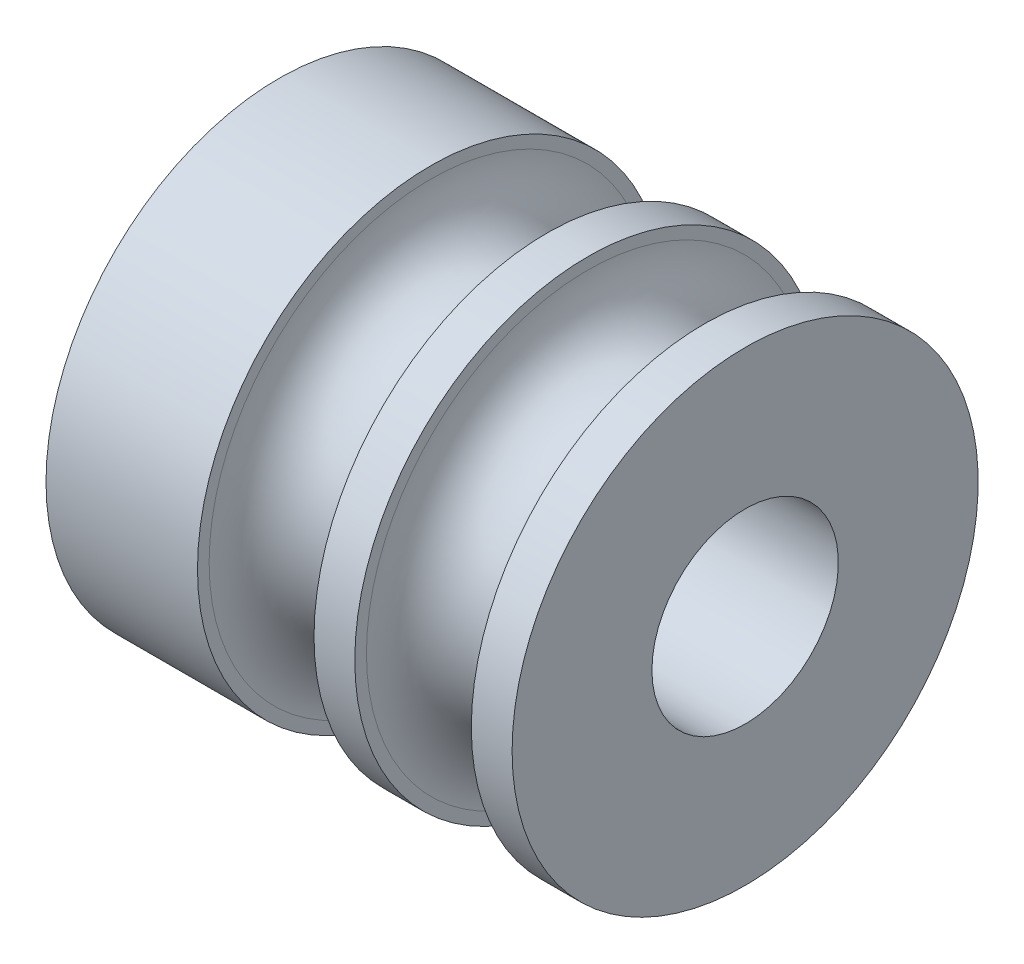
ISO-10303-21;
HEADER;
FILE_DESCRIPTION(('STEP AP214'),'2;1');
FILE_NAME('part.step','',(''),(''),'','','');
FILE_SCHEMA(('AUTOMOTIVE_DESIGN { 1 0 10303 214 1 1 1 1 }'));
ENDSEC;
DATA;
#1=APPLICATION_CONTEXT('core data for automotive mechanical design processes');
#2=APPLICATION_PROTOCOL_DEFINITION('international standard','automotive_design',2000,#1);
#3=PRODUCT_CONTEXT('',#1,'mechanical');
#4=PRODUCT('Part','Part','',(#3));
#5=PRODUCT_RELATED_PRODUCT_CATEGORY('part','',(#4));
#6=PRODUCT_DEFINITION_FORMATION('','',#4);
#7=PRODUCT_DEFINITION_CONTEXT('part definition',#1,'design');
#8=PRODUCT_DEFINITION('design','',#6,#7);
#9=PRODUCT_DEFINITION_SHAPE('','',#8);
#10=(LENGTH_UNIT() NAMED_UNIT(*) SI_UNIT(.MILLI.,.METRE.));
#11=(NAMED_UNIT(*) PLANE_ANGLE_UNIT() SI_UNIT($,.RADIAN.));
#12=(NAMED_UNIT(*) SI_UNIT($,.STERADIAN.) SOLID_ANGLE_UNIT());
#13=UNCERTAINTY_MEASURE_WITH_UNIT(LENGTH_MEASURE(1.E-05),#10,'distance_accuracy_value','');
#14=(GEOMETRIC_REPRESENTATION_CONTEXT(3) GLOBAL_UNCERTAINTY_ASSIGNED_CONTEXT((#13)) GLOBAL_UNIT_ASSIGNED_CONTEXT((#10,
#11,#12)) REPRESENTATION_CONTEXT('',''));
#15=CARTESIAN_POINT('',(0.,0.,0.));
#16=DIRECTION('',(0.,0.,1.));
#17=DIRECTION('',(1.,0.,0.));
#18=AXIS2_PLACEMENT_3D('',#15,#16,#17);
#19=CARTESIAN_POINT('',(-17.2227978711453,0.,0.));
#20=DIRECTION('',(-1.,0.,0.));
#21=DIRECTION('',(0.,0.,1.));
#22=AXIS2_PLACEMENT_3D('',#19,#20,#21);
#23=CYLINDRICAL_SURFACE('',#22,10.);
#24=CARTESIAN_POINT('',(-10.,0.,0.));
#25=DIRECTION('',(-1.,0.,0.));
#26=DIRECTION('',(0.,0.,1.));
#27=AXIS2_PLACEMENT_3D('',#24,#25,#26);
#28=CIRCLE('',#27,10.);
#29=CARTESIAN_POINT('',(-10.,0.,10.));
#30=VERTEX_POINT('',#29);
#31=EDGE_CURVE('E10',#30,#30,#28,.T.);
#32=ORIENTED_EDGE('',*,*,#31,.F.);
#33=EDGE_LOOP('',(#32));
#34=FACE_BOUND('',#33,.T.);
#35=CARTESIAN_POINT('',(-3.5,0.,0.));
#36=DIRECTION('',(-1.,0.,0.));
#37=DIRECTION('',(0.,0.,1.));
#38=AXIS2_PLACEMENT_3D('',#35,#36,#37);
#39=CIRCLE('',#38,10.);
#40=CARTESIAN_POINT('',(-3.5,0.,10.));
#41=VERTEX_POINT('',#40);
#42=EDGE_CURVE('E70',#41,#41,#39,.T.);
#43=ORIENTED_EDGE('',*,*,#42,.T.);
#44=EDGE_LOOP('',(#43));
#45=FACE_BOUND('',#44,.T.);
#46=ADVANCED_FACE('F30',(#34,#45),#23,.T.);
#47=CARTESIAN_POINT('',(-10.,0.,-10.));
#48=DIRECTION('',(1.,0.,0.));
#49=DIRECTION('',(0.,0.,-1.));
#50=AXIS2_PLACEMENT_3D('',#47,#48,#49);
#51=PLANE('',#50);
#52=CARTESIAN_POINT('',(-10.,0.,0.));
#53=DIRECTION('',(-1.,0.,0.));
#54=DIRECTION('',(0.,0.,1.));
#55=AXIS2_PLACEMENT_3D('',#52,#53,#54);
#56=CIRCLE('',#55,4.);
#57=CARTESIAN_POINT('',(-10.,0.,4.));
#58=VERTEX_POINT('',#57);
#59=EDGE_CURVE('E36',#58,#58,#56,.T.);
#60=ORIENTED_EDGE('',*,*,#59,.F.);
#61=EDGE_LOOP('',(#60));
#62=FACE_BOUND('',#61,.T.);
#63=ORIENTED_EDGE('',*,*,#31,.T.);
#64=EDGE_LOOP('',(#63));
#65=FACE_BOUND('',#64,.T.);
#66=ADVANCED_FACE('F131',(#62,#65),#51,.F.);
#67=CARTESIAN_POINT('',(-17.2227978711453,0.,0.));
#68=DIRECTION('',(-1.,0.,0.));
#69=DIRECTION('',(0.,0.,1.));
#70=AXIS2_PLACEMENT_3D('',#67,#68,#69);
#71=CYLINDRICAL_SURFACE('',#70,4.);
#72=CARTESIAN_POINT('',(10.,0.,0.));
#73=DIRECTION('',(-1.,0.,0.));
#74=DIRECTION('',(0.,0.,1.));
#75=AXIS2_PLACEMENT_3D('',#72,#73,#74);
#76=CIRCLE('',#75,4.);
#77=CARTESIAN_POINT('',(10.,0.,3.99999999999999));
#78=VERTEX_POINT('',#77);
#79=EDGE_CURVE('E40',#78,#78,#76,.T.);
#80=ORIENTED_EDGE('',*,*,#79,.F.);
#81=EDGE_LOOP('',(#80));
#82=FACE_BOUND('',#81,.T.);
#83=ORIENTED_EDGE('',*,*,#59,.T.);
#84=EDGE_LOOP('',(#83));
#85=FACE_BOUND('',#84,.T.);
#86=ADVANCED_FACE('F126',(#82,#85),#71,.F.);
#87=CARTESIAN_POINT('',(10.,0.,-10.));
#88=DIRECTION('',(-1.,0.,0.));
#89=DIRECTION('',(0.,0.,1.));
#90=AXIS2_PLACEMENT_3D('',#87,#88,#89);
#91=PLANE('',#90);
#92=CARTESIAN_POINT('',(10.,0.,0.));
#93=DIRECTION('',(-1.,0.,0.));
#94=DIRECTION('',(0.,0.,1.));
#95=AXIS2_PLACEMENT_3D('',#92,#93,#94);
#96=CIRCLE('',#95,10.);
#97=CARTESIAN_POINT('',(10.,0.,9.99999999999999));
#98=VERTEX_POINT('',#97);
#99=EDGE_CURVE('E44',#98,#98,#96,.T.);
#100=ORIENTED_EDGE('',*,*,#99,.F.);
#101=EDGE_LOOP('',(#100));
#102=FACE_BOUND('',#101,.T.);
#103=ORIENTED_EDGE('',*,*,#79,.T.);
#104=EDGE_LOOP('',(#103));
#105=FACE_BOUND('',#104,.T.);
#106=ADVANCED_FACE('F120',(#102,#105),#91,.F.);
#107=CARTESIAN_POINT('',(-17.2227978711453,0.,0.));
#108=DIRECTION('',(-1.,0.,0.));
#109=DIRECTION('',(0.,0.,1.));
#110=AXIS2_PLACEMENT_3D('',#107,#108,#109);
#111=CYLINDRICAL_SURFACE('',#110,10.);
#112=CARTESIAN_POINT('',(8.25,0.,0.));
#113=DIRECTION('',(-1.,0.,0.));
#114=DIRECTION('',(0.,0.,1.));
#115=AXIS2_PLACEMENT_3D('',#112,#113,#114);
#116=CIRCLE('',#115,10.);
#117=CARTESIAN_POINT('',(8.25,0.,9.99999999999999));
#118=VERTEX_POINT('',#117);
#119=EDGE_CURVE('E49',#118,#118,#116,.T.);
#120=ORIENTED_EDGE('',*,*,#119,.F.);
#121=EDGE_LOOP('',(#120));
#122=FACE_BOUND('',#121,.T.);
#123=ORIENTED_EDGE('',*,*,#99,.T.);
#124=EDGE_LOOP('',(#123));
#125=FACE_BOUND('',#124,.T.);
#126=ADVANCED_FACE('F114',(#122,#125),#111,.T.);
#127=CARTESIAN_POINT('',(8.25,0.,-10.));
#128=DIRECTION('',(1.,0.,0.));
#129=DIRECTION('',(0.,0.,-1.));
#130=AXIS2_PLACEMENT_3D('',#127,#128,#129);
#131=PLANE('',#130);
#132=CARTESIAN_POINT('',(8.25,0.,0.));
#133=DIRECTION('',(-1.,0.,0.));
#134=DIRECTION('',(0.,0.,1.));
#135=AXIS2_PLACEMENT_3D('',#132,#133,#134);
#136=CIRCLE('',#135,9.5);
#137=CARTESIAN_POINT('',(8.25,0.,9.49999999999999));
#138=VERTEX_POINT('',#137);
#139=EDGE_CURVE('E52',#138,#138,#136,.T.);
#140=ORIENTED_EDGE('',*,*,#139,.F.);
#141=EDGE_LOOP('',(#140));
#142=FACE_BOUND('',#141,.T.);
#143=ORIENTED_EDGE('',*,*,#119,.T.);
#144=EDGE_LOOP('',(#143));
#145=FACE_BOUND('',#144,.T.);
#146=ADVANCED_FACE('F108',(#142,#145),#131,.F.);
#147=CARTESIAN_POINT('',(5.75,0.,0.));
#148=DIRECTION('',(-1.,0.,0.));
#149=DIRECTION('',(0.,0.,1.));
#150=AXIS2_PLACEMENT_3D('',#147,#148,#149);
#151=TOROIDAL_SURFACE('',#150,9.5,2.5);
#152=CARTESIAN_POINT('',(3.25,0.,0.));
#153=DIRECTION('',(-1.,0.,0.));
#154=DIRECTION('',(0.,0.,1.));
#155=AXIS2_PLACEMENT_3D('',#152,#153,#154);
#156=CIRCLE('',#155,9.5);
#157=CARTESIAN_POINT('',(3.25,0.,9.5));
#158=VERTEX_POINT('',#157);
#159=EDGE_CURVE('E55',#158,#158,#156,.T.);
#160=ORIENTED_EDGE('',*,*,#159,.F.);
#161=EDGE_LOOP('',(#160));
#162=FACE_BOUND('',#161,.T.);
#163=ORIENTED_EDGE('',*,*,#139,.T.);
#164=EDGE_LOOP('',(#163));
#165=FACE_BOUND('',#164,.T.);
#166=ADVANCED_FACE('F102',(#162,#165),#151,.F.);
#167=CARTESIAN_POINT('',(3.25,0.,-10.));
#168=DIRECTION('',(-1.,0.,0.));
#169=DIRECTION('',(0.,0.,1.));
#170=AXIS2_PLACEMENT_3D('',#167,#168,#169);
#171=PLANE('',#170);
#172=CARTESIAN_POINT('',(3.25,0.,0.));
#173=DIRECTION('',(-1.,0.,0.));
#174=DIRECTION('',(0.,0.,1.));
#175=AXIS2_PLACEMENT_3D('',#172,#173,#174);
#176=CIRCLE('',#175,10.);
#177=CARTESIAN_POINT('',(3.25,0.,10.));
#178=VERTEX_POINT('',#177);
#179=EDGE_CURVE('E58',#178,#178,#176,.T.);
#180=ORIENTED_EDGE('',*,*,#179,.F.);
#181=EDGE_LOOP('',(#180));
#182=FACE_BOUND('',#181,.T.);
#183=ORIENTED_EDGE('',*,*,#159,.T.);
#184=EDGE_LOOP('',(#183));
#185=FACE_BOUND('',#184,.T.);
#186=ADVANCED_FACE('F96',(#182,#185),#171,.F.);
#187=CARTESIAN_POINT('',(-17.2227978711453,0.,0.));
#188=DIRECTION('',(-1.,0.,0.));
#189=DIRECTION('',(0.,0.,1.));
#190=AXIS2_PLACEMENT_3D('',#187,#188,#189);
#191=CYLINDRICAL_SURFACE('',#190,10.);
#192=CARTESIAN_POINT('',(1.5,0.,0.));
#193=DIRECTION('',(-1.,0.,0.));
#194=DIRECTION('',(0.,0.,1.));
#195=AXIS2_PLACEMENT_3D('',#192,#193,#194);
#196=CIRCLE('',#195,10.);
#197=CARTESIAN_POINT('',(1.5,0.,10.));
#198=VERTEX_POINT('',#197);
#199=EDGE_CURVE('E61',#198,#198,#196,.T.);
#200=ORIENTED_EDGE('',*,*,#199,.F.);
#201=EDGE_LOOP('',(#200));
#202=FACE_BOUND('',#201,.T.);
#203=ORIENTED_EDGE('',*,*,#179,.T.);
#204=EDGE_LOOP('',(#203));
#205=FACE_BOUND('',#204,.T.);
#206=ADVANCED_FACE('F90',(#202,#205),#191,.T.);
#207=CARTESIAN_POINT('',(1.5,0.,-10.));
#208=DIRECTION('',(1.,0.,0.));
#209=DIRECTION('',(0.,0.,-1.));
#210=AXIS2_PLACEMENT_3D('',#207,#208,#209);
#211=PLANE('',#210);
#212=CARTESIAN_POINT('',(1.5,0.,0.));
#213=DIRECTION('',(-1.,0.,0.));
#214=DIRECTION('',(0.,0.,1.));
#215=AXIS2_PLACEMENT_3D('',#212,#213,#214);
#216=CIRCLE('',#215,9.5);
#217=CARTESIAN_POINT('',(1.5,0.,9.5));
#218=VERTEX_POINT('',#217);
#219=EDGE_CURVE('E64',#218,#218,#216,.T.);
#220=ORIENTED_EDGE('',*,*,#219,.F.);
#221=EDGE_LOOP('',(#220));
#222=FACE_BOUND('',#221,.T.);
#223=ORIENTED_EDGE('',*,*,#199,.T.);
#224=EDGE_LOOP('',(#223));
#225=FACE_BOUND('',#224,.T.);
#226=ADVANCED_FACE('F84',(#222,#225),#211,.F.);
#227=CARTESIAN_POINT('',(-1.,0.,0.));
#228=DIRECTION('',(-1.,0.,0.));
#229=DIRECTION('',(0.,0.,1.));
#230=AXIS2_PLACEMENT_3D('',#227,#228,#229);
#231=TOROIDAL_SURFACE('',#230,9.5,2.5);
#232=CARTESIAN_POINT('',(-3.5,0.,0.));
#233=DIRECTION('',(-1.,0.,0.));
#234=DIRECTION('',(0.,0.,1.));
#235=AXIS2_PLACEMENT_3D('',#232,#233,#234);
#236=CIRCLE('',#235,9.5);
#237=CARTESIAN_POINT('',(-3.5,0.,9.5));
#238=VERTEX_POINT('',#237);
#239=EDGE_CURVE('E67',#238,#238,#236,.T.);
#240=ORIENTED_EDGE('',*,*,#239,.F.);
#241=EDGE_LOOP('',(#240));
#242=FACE_BOUND('',#241,.T.);
#243=ORIENTED_EDGE('',*,*,#219,.T.);
#244=EDGE_LOOP('',(#243));
#245=FACE_BOUND('',#244,.T.);
#246=ADVANCED_FACE('F78',(#242,#245),#231,.F.);
#247=CARTESIAN_POINT('',(-3.5,0.,-10.));
#248=DIRECTION('',(-1.,0.,0.));
#249=DIRECTION('',(0.,0.,1.));
#250=AXIS2_PLACEMENT_3D('',#247,#248,#249);
#251=PLANE('',#250);
#252=ORIENTED_EDGE('',*,*,#42,.F.);
#253=EDGE_LOOP('',(#252));
#254=FACE_BOUND('',#253,.T.);
#255=ORIENTED_EDGE('',*,*,#239,.T.);
#256=EDGE_LOOP('',(#255));
#257=FACE_BOUND('',#256,.T.);
#258=ADVANCED_FACE('F75',(#254,#257),#251,.F.);
#259=CLOSED_SHELL('',(#46,#66,#86,#106,#126,#146,#166,#186,#206,#226,#246,#258));
#260=MANIFOLD_SOLID_BREP('B2',#259);
#261=ADVANCED_BREP_SHAPE_REPRESENTATION('',(#18,#260),#14);
#262=SHAPE_DEFINITION_REPRESENTATION(#9,#261);
ENDSEC;
END-ISO-10303-21;
